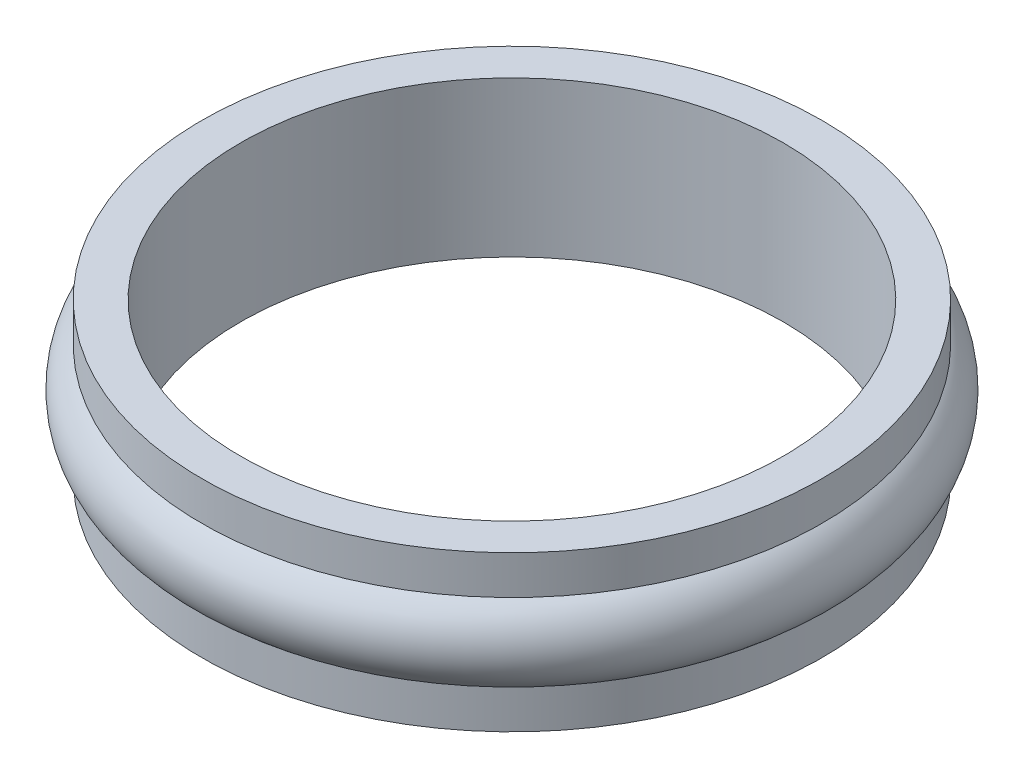
ISO-10303-21;
HEADER;
FILE_DESCRIPTION(('STEP AP214'),'2;1');
FILE_NAME('part.step','',(''),(''),'','','');
FILE_SCHEMA(('AUTOMOTIVE_DESIGN { 1 0 10303 214 1 1 1 1 }'));
ENDSEC;
DATA;
#1=APPLICATION_CONTEXT('core data for automotive mechanical design processes');
#2=APPLICATION_PROTOCOL_DEFINITION('international standard','automotive_design',2000,#1);
#3=PRODUCT_CONTEXT('',#1,'mechanical');
#4=PRODUCT('Part','Part','',(#3));
#5=PRODUCT_RELATED_PRODUCT_CATEGORY('part','',(#4));
#6=PRODUCT_DEFINITION_FORMATION('','',#4);
#7=PRODUCT_DEFINITION_CONTEXT('part definition',#1,'design');
#8=PRODUCT_DEFINITION('design','',#6,#7);
#9=PRODUCT_DEFINITION_SHAPE('','',#8);
#10=(LENGTH_UNIT() NAMED_UNIT(*) SI_UNIT(.MILLI.,.METRE.));
#11=(NAMED_UNIT(*) PLANE_ANGLE_UNIT() SI_UNIT($,.RADIAN.));
#12=(NAMED_UNIT(*) SI_UNIT($,.STERADIAN.) SOLID_ANGLE_UNIT());
#13=UNCERTAINTY_MEASURE_WITH_UNIT(LENGTH_MEASURE(1.E-05),#10,'distance_accuracy_value','');
#14=(GEOMETRIC_REPRESENTATION_CONTEXT(3) GLOBAL_UNCERTAINTY_ASSIGNED_CONTEXT((#13)) GLOBAL_UNIT_ASSIGNED_CONTEXT((#10,
#11,#12)) REPRESENTATION_CONTEXT('',''));
#15=CARTESIAN_POINT('',(0.,0.,0.));
#16=DIRECTION('',(0.,0.,1.));
#17=DIRECTION('',(1.,0.,0.));
#18=AXIS2_PLACEMENT_3D('',#15,#16,#17);
#19=CARTESIAN_POINT('',(22.225,12.7,0.));
#20=DIRECTION('',(0.,1.,0.));
#21=DIRECTION('',(0.,0.,1.));
#22=AXIS2_PLACEMENT_3D('',#19,#20,#21);
#23=PLANE('',#22);
#24=CARTESIAN_POINT('',(0.,12.7,0.));
#25=DIRECTION('',(0.,-1.,0.));
#26=DIRECTION('',(0.,0.,-1.));
#27=AXIS2_PLACEMENT_3D('',#24,#25,#26);
#28=CIRCLE('',#27,22.225);
#29=CARTESIAN_POINT('',(0.,12.7,-22.225));
#30=VERTEX_POINT('',#29);
#31=EDGE_CURVE('E52',#30,#30,#28,.T.);
#32=ORIENTED_EDGE('',*,*,#31,.T.);
#33=EDGE_LOOP('',(#32));
#34=FACE_BOUND('',#33,.T.);
#35=CARTESIAN_POINT('',(0.,12.7,0.));
#36=DIRECTION('',(0.,-1.,0.));
#37=DIRECTION('',(0.,0.,-1.));
#38=AXIS2_PLACEMENT_3D('',#35,#36,#37);
#39=CIRCLE('',#38,25.4);
#40=CARTESIAN_POINT('',(0.,12.7,-25.4));
#41=VERTEX_POINT('',#40);
#42=EDGE_CURVE('E10',#41,#41,#39,.T.);
#43=ORIENTED_EDGE('',*,*,#42,.F.);
#44=EDGE_LOOP('',(#43));
#45=FACE_BOUND('',#44,.T.);
#46=ADVANCED_FACE('F30',(#34,#45),#23,.T.);
#47=CARTESIAN_POINT('',(0.,0.,0.));
#48=DIRECTION('',(0.,-1.,0.));
#49=DIRECTION('',(0.,0.,-1.));
#50=AXIS2_PLACEMENT_3D('',#47,#48,#49);
#51=CYLINDRICAL_SURFACE('',#50,25.4);
#52=ORIENTED_EDGE('',*,*,#42,.T.);
#53=EDGE_LOOP('',(#52));
#54=FACE_BOUND('',#53,.T.);
#55=CARTESIAN_POINT('',(0.,9.525,0.));
#56=DIRECTION('',(0.,-1.,0.));
#57=DIRECTION('',(0.,0.,-1.));
#58=AXIS2_PLACEMENT_3D('',#55,#56,#57);
#59=CIRCLE('',#58,25.4);
#60=CARTESIAN_POINT('',(0.,9.525,-25.4));
#61=VERTEX_POINT('',#60);
#62=EDGE_CURVE('E36',#61,#61,#59,.T.);
#63=ORIENTED_EDGE('',*,*,#62,.F.);
#64=EDGE_LOOP('',(#63));
#65=FACE_BOUND('',#64,.T.);
#66=ADVANCED_FACE('F70',(#54,#65),#51,.T.);
#67=CARTESIAN_POINT('',(0.,6.35,0.));
#68=DIRECTION('',(0.,-1.,0.));
#69=DIRECTION('',(0.,0.,-1.));
#70=AXIS2_PLACEMENT_3D('',#67,#68,#69);
#71=TOROIDAL_SURFACE('',#70,23.01875,3.96875);
#72=ORIENTED_EDGE('',*,*,#62,.T.);
#73=EDGE_LOOP('',(#72));
#74=FACE_BOUND('',#73,.T.);
#75=CARTESIAN_POINT('',(0.,3.175,0.));
#76=DIRECTION('',(0.,-1.,0.));
#77=DIRECTION('',(0.,0.,-1.));
#78=AXIS2_PLACEMENT_3D('',#75,#76,#77);
#79=CIRCLE('',#78,25.4);
#80=CARTESIAN_POINT('',(0.,3.175,-25.4));
#81=VERTEX_POINT('',#80);
#82=EDGE_CURVE('E40',#81,#81,#79,.T.);
#83=ORIENTED_EDGE('',*,*,#82,.F.);
#84=EDGE_LOOP('',(#83));
#85=FACE_BOUND('',#84,.T.);
#86=ADVANCED_FACE('F74',(#74,#85),#71,.T.);
#87=CARTESIAN_POINT('',(0.,0.,0.));
#88=DIRECTION('',(0.,-1.,0.));
#89=DIRECTION('',(0.,0.,-1.));
#90=AXIS2_PLACEMENT_3D('',#87,#88,#89);
#91=CYLINDRICAL_SURFACE('',#90,25.4);
#92=ORIENTED_EDGE('',*,*,#82,.T.);
#93=EDGE_LOOP('',(#92));
#94=FACE_BOUND('',#93,.T.);
#95=CARTESIAN_POINT('',(0.,0.,0.));
#96=DIRECTION('',(0.,-1.,0.));
#97=DIRECTION('',(0.,0.,-1.));
#98=AXIS2_PLACEMENT_3D('',#95,#96,#97);
#99=CIRCLE('',#98,25.4);
#100=CARTESIAN_POINT('',(0.,0.,-25.4));
#101=VERTEX_POINT('',#100);
#102=EDGE_CURVE('E44',#101,#101,#99,.T.);
#103=ORIENTED_EDGE('',*,*,#102,.F.);
#104=EDGE_LOOP('',(#103));
#105=FACE_BOUND('',#104,.T.);
#106=ADVANCED_FACE('F66',(#94,#105),#91,.T.);
#107=CARTESIAN_POINT('',(25.4,0.,0.));
#108=DIRECTION('',(0.,-1.,0.));
#109=DIRECTION('',(0.,0.,-1.));
#110=AXIS2_PLACEMENT_3D('',#107,#108,#109);
#111=PLANE('',#110);
#112=ORIENTED_EDGE('',*,*,#102,.T.);
#113=EDGE_LOOP('',(#112));
#114=FACE_BOUND('',#113,.T.);
#115=CARTESIAN_POINT('',(0.,0.,0.));
#116=DIRECTION('',(0.,-1.,0.));
#117=DIRECTION('',(0.,0.,-1.));
#118=AXIS2_PLACEMENT_3D('',#115,#116,#117);
#119=CIRCLE('',#118,22.225);
#120=CARTESIAN_POINT('',(0.,0.,-22.225));
#121=VERTEX_POINT('',#120);
#122=EDGE_CURVE('E49',#121,#121,#119,.T.);
#123=ORIENTED_EDGE('',*,*,#122,.F.);
#124=EDGE_LOOP('',(#123));
#125=FACE_BOUND('',#124,.T.);
#126=ADVANCED_FACE('F60',(#114,#125),#111,.T.);
#127=CARTESIAN_POINT('',(0.,0.,0.));
#128=DIRECTION('',(0.,-1.,0.));
#129=DIRECTION('',(0.,0.,-1.));
#130=AXIS2_PLACEMENT_3D('',#127,#128,#129);
#131=CYLINDRICAL_SURFACE('',#130,22.225);
#132=ORIENTED_EDGE('',*,*,#122,.T.);
#133=EDGE_LOOP('',(#132));
#134=FACE_BOUND('',#133,.T.);
#135=ORIENTED_EDGE('',*,*,#31,.F.);
#136=EDGE_LOOP('',(#135));
#137=FACE_BOUND('',#136,.T.);
#138=ADVANCED_FACE('F58',(#134,#137),#131,.F.);
#139=CLOSED_SHELL('',(#46,#66,#86,#106,#126,#138));
#140=MANIFOLD_SOLID_BREP('B2',#139);
#141=ADVANCED_BREP_SHAPE_REPRESENTATION('',(#18,#140),#14);
#142=SHAPE_DEFINITION_REPRESENTATION(#9,#141);
ENDSEC;
END-ISO-10303-21;
